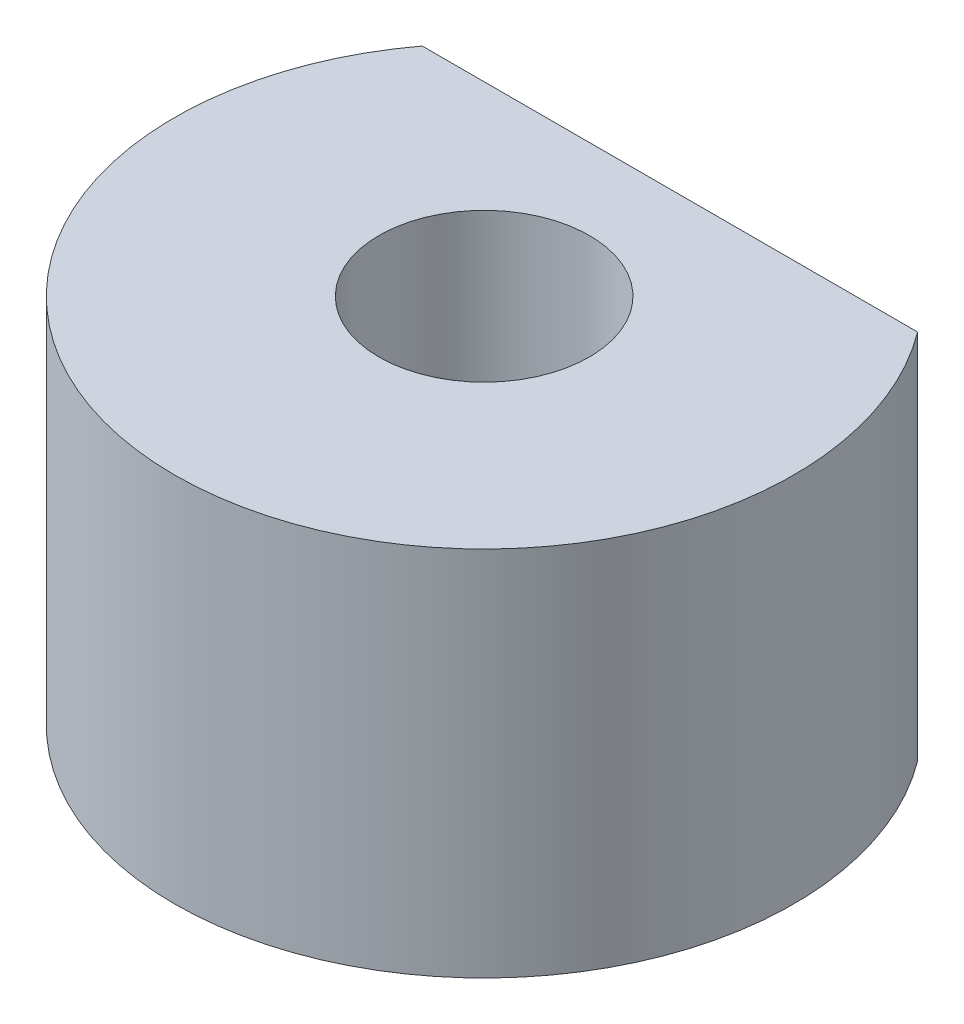
ISO-10303-21;
HEADER;
FILE_DESCRIPTION(('STEP AP214'),'2;1');
FILE_NAME('part.step','',(''),(''),'','','');
FILE_SCHEMA(('AUTOMOTIVE_DESIGN { 1 0 10303 214 1 1 1 1 }'));
ENDSEC;
DATA;
#1=APPLICATION_CONTEXT('core data for automotive mechanical design processes');
#2=APPLICATION_PROTOCOL_DEFINITION('international standard','automotive_design',2000,#1);
#3=PRODUCT_CONTEXT('',#1,'mechanical');
#4=PRODUCT('Part','Part','',(#3));
#5=PRODUCT_RELATED_PRODUCT_CATEGORY('part','',(#4));
#6=PRODUCT_DEFINITION_FORMATION('','',#4);
#7=PRODUCT_DEFINITION_CONTEXT('part definition',#1,'design');
#8=PRODUCT_DEFINITION('design','',#6,#7);
#9=PRODUCT_DEFINITION_SHAPE('','',#8);
#10=(LENGTH_UNIT() NAMED_UNIT(*) SI_UNIT(.MILLI.,.METRE.));
#11=(NAMED_UNIT(*) PLANE_ANGLE_UNIT() SI_UNIT($,.RADIAN.));
#12=(NAMED_UNIT(*) SI_UNIT($,.STERADIAN.) SOLID_ANGLE_UNIT());
#13=UNCERTAINTY_MEASURE_WITH_UNIT(LENGTH_MEASURE(1.E-05),#10,'distance_accuracy_value','');
#14=(GEOMETRIC_REPRESENTATION_CONTEXT(3) GLOBAL_UNCERTAINTY_ASSIGNED_CONTEXT((#13)) GLOBAL_UNIT_ASSIGNED_CONTEXT((#10,
#11,#12)) REPRESENTATION_CONTEXT('',''));
#15=CARTESIAN_POINT('',(0.,0.,0.));
#16=DIRECTION('',(0.,0.,1.));
#17=DIRECTION('',(1.,0.,0.));
#18=AXIS2_PLACEMENT_3D('',#15,#16,#17);
#19=CARTESIAN_POINT('',(0.,6.,0.));
#20=DIRECTION('',(0.,1.,0.));
#21=DIRECTION('',(0.,0.,1.));
#22=AXIS2_PLACEMENT_3D('',#19,#20,#21);
#23=PLANE('',#22);
#24=CARTESIAN_POINT('',(0.,6.,0.));
#25=DIRECTION('',(0.,1.,0.));
#26=DIRECTION('',(0.,0.,1.));
#27=AXIS2_PLACEMENT_3D('',#24,#25,#26);
#28=CIRCLE('',#27,5.);
#29=CARTESIAN_POINT('',(-4.,6.,-3.));
#30=VERTEX_POINT('',#29);
#31=CARTESIAN_POINT('',(4.,6.,-3.));
#32=VERTEX_POINT('',#31);
#33=EDGE_CURVE('E64',#30,#32,#28,.T.);
#34=ORIENTED_EDGE('',*,*,#33,.T.);
#35=DIRECTION('',(-1.,0.,0.));
#36=VECTOR('',#35,1.);
#37=CARTESIAN_POINT('',(-4.,6.,-3.));
#38=LINE('',#37,#36);
#39=EDGE_CURVE('E49',#32,#30,#38,.T.);
#40=ORIENTED_EDGE('',*,*,#39,.T.);
#41=EDGE_LOOP('',(#34,#40));
#42=FACE_BOUND('',#41,.T.);
#43=CARTESIAN_POINT('',(0.,6.,0.));
#44=DIRECTION('',(0.,1.,0.));
#45=DIRECTION('',(0.,0.,1.));
#46=AXIS2_PLACEMENT_3D('',#43,#44,#45);
#47=CIRCLE('',#46,1.7);
#48=CARTESIAN_POINT('',(0.,6.,1.7));
#49=VERTEX_POINT('',#48);
#50=EDGE_CURVE('E70',#49,#49,#47,.T.);
#51=ORIENTED_EDGE('',*,*,#50,.F.);
#52=EDGE_LOOP('',(#51));
#53=FACE_BOUND('',#52,.T.);
#54=ADVANCED_FACE('F33',(#42,#53),#23,.T.);
#55=CARTESIAN_POINT('',(0.,0.,0.));
#56=DIRECTION('',(0.,1.,0.));
#57=DIRECTION('',(0.,0.,1.));
#58=AXIS2_PLACEMENT_3D('',#55,#56,#57);
#59=PLANE('',#58);
#60=CARTESIAN_POINT('',(0.,0.,0.));
#61=DIRECTION('',(0.,1.,0.));
#62=DIRECTION('',(0.,0.,1.));
#63=AXIS2_PLACEMENT_3D('',#60,#61,#62);
#64=CIRCLE('',#63,5.);
#65=CARTESIAN_POINT('',(-4.,0.,-3.));
#66=VERTEX_POINT('',#65);
#67=CARTESIAN_POINT('',(4.,0.,-3.));
#68=VERTEX_POINT('',#67);
#69=EDGE_CURVE('E65',#66,#68,#64,.T.);
#70=ORIENTED_EDGE('',*,*,#69,.F.);
#71=DIRECTION('',(-1.,0.,0.));
#72=VECTOR('',#71,1.);
#73=CARTESIAN_POINT('',(-4.,0.,-3.));
#74=LINE('',#73,#72);
#75=EDGE_CURVE('E57',#68,#66,#74,.T.);
#76=ORIENTED_EDGE('',*,*,#75,.F.);
#77=EDGE_LOOP('',(#70,#76));
#78=FACE_BOUND('',#77,.T.);
#79=CARTESIAN_POINT('',(0.,0.,0.));
#80=DIRECTION('',(0.,1.,0.));
#81=DIRECTION('',(0.,0.,1.));
#82=AXIS2_PLACEMENT_3D('',#79,#80,#81);
#83=CIRCLE('',#82,1.7);
#84=CARTESIAN_POINT('',(0.,0.,1.7));
#85=VERTEX_POINT('',#84);
#86=EDGE_CURVE('E73',#85,#85,#83,.T.);
#87=ORIENTED_EDGE('',*,*,#86,.T.);
#88=EDGE_LOOP('',(#87));
#89=FACE_BOUND('',#88,.T.);
#90=ADVANCED_FACE('F68',(#78,#89),#59,.F.);
#91=CARTESIAN_POINT('',(0.,6.,0.));
#92=DIRECTION('',(0.,-1.,0.));
#93=DIRECTION('',(0.,0.,-1.));
#94=AXIS2_PLACEMENT_3D('',#91,#92,#93);
#95=CYLINDRICAL_SURFACE('',#94,5.);
#96=ORIENTED_EDGE('',*,*,#69,.T.);
#97=DIRECTION('',(0.,-1.,0.));
#98=VECTOR('',#97,1.);
#99=CARTESIAN_POINT('',(4.,6.,-3.));
#100=LINE('',#99,#98);
#101=EDGE_CURVE('E11',#32,#68,#100,.T.);
#102=ORIENTED_EDGE('',*,*,#101,.F.);
#103=ORIENTED_EDGE('',*,*,#33,.F.);
#104=DIRECTION('',(0.,-1.,0.));
#105=VECTOR('',#104,1.);
#106=CARTESIAN_POINT('',(-4.,6.,-3.));
#107=LINE('',#106,#105);
#108=EDGE_CURVE('E42',#30,#66,#107,.T.);
#109=ORIENTED_EDGE('',*,*,#108,.T.);
#110=EDGE_LOOP('',(#96,#102,#103,#109));
#111=FACE_BOUND('',#110,.T.);
#112=ADVANCED_FACE('F35',(#111),#95,.T.);
#113=CARTESIAN_POINT('',(-4.,6.,-3.));
#114=DIRECTION('',(0.,0.,1.));
#115=DIRECTION('',(1.,0.,0.));
#116=AXIS2_PLACEMENT_3D('',#113,#114,#115);
#117=PLANE('',#116);
#118=ORIENTED_EDGE('',*,*,#75,.T.);
#119=ORIENTED_EDGE('',*,*,#108,.F.);
#120=ORIENTED_EDGE('',*,*,#39,.F.);
#121=ORIENTED_EDGE('',*,*,#101,.T.);
#122=EDGE_LOOP('',(#118,#119,#120,#121));
#123=FACE_BOUND('',#122,.T.);
#124=ADVANCED_FACE('F60',(#123),#117,.F.);
#125=CARTESIAN_POINT('',(0.,6.,0.));
#126=DIRECTION('',(0.,-1.,0.));
#127=DIRECTION('',(0.,0.,-1.));
#128=AXIS2_PLACEMENT_3D('',#125,#126,#127);
#129=CYLINDRICAL_SURFACE('',#128,1.7);
#130=ORIENTED_EDGE('',*,*,#50,.T.);
#131=EDGE_LOOP('',(#130));
#132=FACE_BOUND('',#131,.T.);
#133=ORIENTED_EDGE('',*,*,#86,.F.);
#134=EDGE_LOOP('',(#133));
#135=FACE_BOUND('',#134,.T.);
#136=ADVANCED_FACE('F81',(#132,#135),#129,.F.);
#137=CLOSED_SHELL('',(#54,#90,#112,#124,#136));
#138=MANIFOLD_SOLID_BREP('B2',#137);
#139=ADVANCED_BREP_SHAPE_REPRESENTATION('',(#18,#138),#14);
#140=SHAPE_DEFINITION_REPRESENTATION(#9,#139);
ENDSEC;
END-ISO-10303-21;
